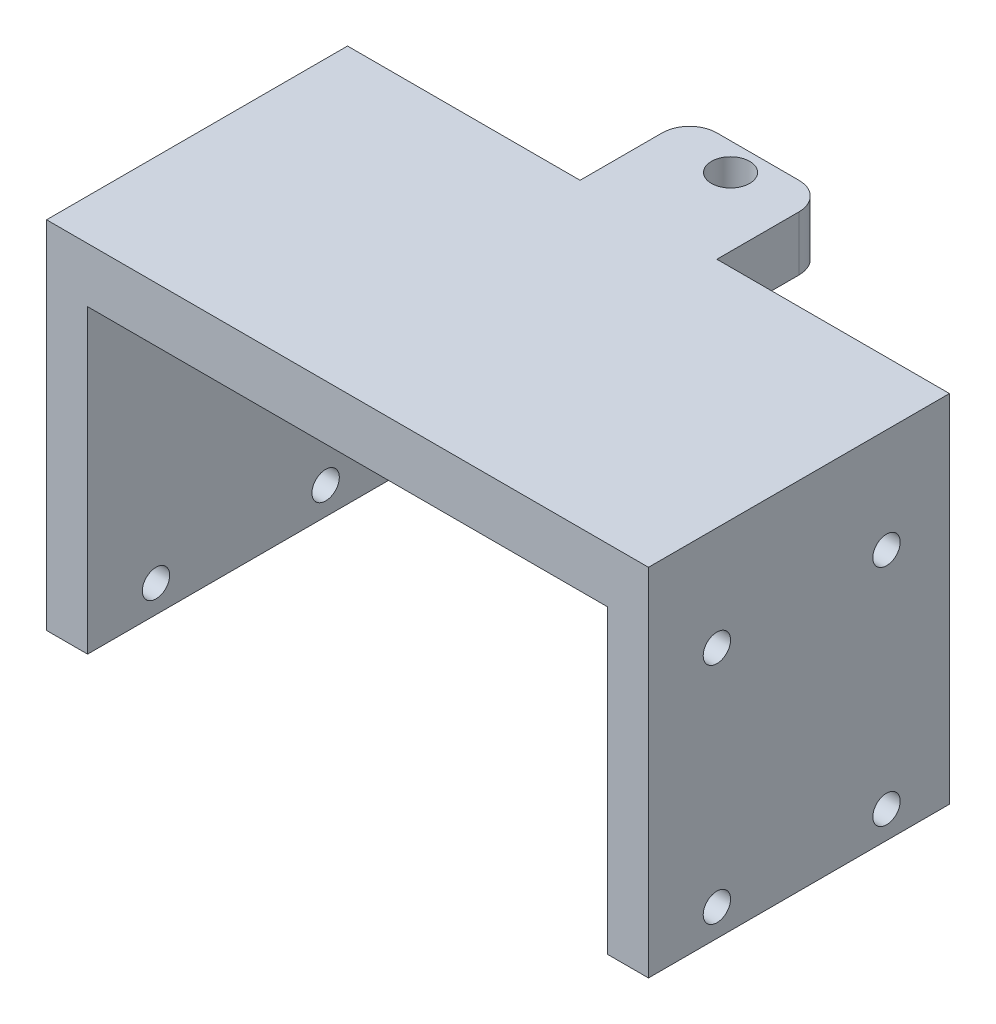
ISO-10303-21;
HEADER;
FILE_DESCRIPTION(('STEP AP214'),'2;1');
FILE_NAME('part.step','',(''),(''),'','','');
FILE_SCHEMA(('AUTOMOTIVE_DESIGN { 1 0 10303 214 1 1 1 1 }'));
ENDSEC;
DATA;
#1=APPLICATION_CONTEXT('core data for automotive mechanical design processes');
#2=APPLICATION_PROTOCOL_DEFINITION('international standard','automotive_design',2000,#1);
#3=PRODUCT_CONTEXT('',#1,'mechanical');
#4=PRODUCT('Part','Part','',(#3));
#5=PRODUCT_RELATED_PRODUCT_CATEGORY('part','',(#4));
#6=PRODUCT_DEFINITION_FORMATION('','',#4);
#7=PRODUCT_DEFINITION_CONTEXT('part definition',#1,'design');
#8=PRODUCT_DEFINITION('design','',#6,#7);
#9=PRODUCT_DEFINITION_SHAPE('','',#8);
#10=(LENGTH_UNIT() NAMED_UNIT(*) SI_UNIT(.MILLI.,.METRE.));
#11=(NAMED_UNIT(*) PLANE_ANGLE_UNIT() SI_UNIT($,.RADIAN.));
#12=(NAMED_UNIT(*) SI_UNIT($,.STERADIAN.) SOLID_ANGLE_UNIT());
#13=UNCERTAINTY_MEASURE_WITH_UNIT(LENGTH_MEASURE(1.E-05),#10,'distance_accuracy_value','');
#14=(GEOMETRIC_REPRESENTATION_CONTEXT(3) GLOBAL_UNCERTAINTY_ASSIGNED_CONTEXT((#13)) GLOBAL_UNIT_ASSIGNED_CONTEXT((#10,
#11,#12)) REPRESENTATION_CONTEXT('',''));
#15=CARTESIAN_POINT('',(0.,0.,0.));
#16=DIRECTION('',(0.,0.,1.));
#17=DIRECTION('',(1.,0.,0.));
#18=AXIS2_PLACEMENT_3D('',#15,#16,#17);
#19=CARTESIAN_POINT('',(0.,0.,0.));
#20=DIRECTION('',(0.,0.,1.));
#21=DIRECTION('',(1.,0.,0.));
#22=AXIS2_PLACEMENT_3D('',#19,#20,#21);
#23=PLANE('',#22);
#24=DIRECTION('',(0.,-1.,0.));
#25=VECTOR('',#24,1.);
#26=CARTESIAN_POINT('',(25.,65.,0.));
#27=LINE('',#26,#25);
#28=CARTESIAN_POINT('',(25.,65.,0.));
#29=VERTEX_POINT('',#28);
#30=CARTESIAN_POINT('',(25.,45.,0.));
#31=VERTEX_POINT('',#30);
#32=EDGE_CURVE('E161',#29,#31,#27,.T.);
#33=ORIENTED_EDGE('',*,*,#32,.F.);
#34=DIRECTION('',(-1.,0.,0.));
#35=VECTOR('',#34,1.);
#36=CARTESIAN_POINT('',(110.,65.,0.));
#37=LINE('',#36,#35);
#38=CARTESIAN_POINT('',(110.,65.,0.));
#39=VERTEX_POINT('',#38);
#40=EDGE_CURVE('E155',#39,#29,#37,.T.);
#41=ORIENTED_EDGE('',*,*,#40,.F.);
#42=DIRECTION('',(0.,1.,0.));
#43=VECTOR('',#42,1.);
#44=CARTESIAN_POINT('',(110.,-65.,0.));
#45=LINE('',#44,#43);
#46=CARTESIAN_POINT('',(110.,-65.,0.));
#47=VERTEX_POINT('',#46);
#48=EDGE_CURVE('E156',#47,#39,#45,.T.);
#49=ORIENTED_EDGE('',*,*,#48,.F.);
#50=DIRECTION('',(1.,0.,0.));
#51=VECTOR('',#50,1.);
#52=CARTESIAN_POINT('',(110.,-65.,0.));
#53=LINE('',#52,#51);
#54=CARTESIAN_POINT('',(95.,-65.,0.));
#55=VERTEX_POINT('',#54);
#56=EDGE_CURVE('E282',#55,#47,#53,.T.);
#57=ORIENTED_EDGE('',*,*,#56,.F.);
#58=DIRECTION('',(0.,1.,0.));
#59=VECTOR('',#58,1.);
#60=CARTESIAN_POINT('',(95.,-65.,0.));
#61=LINE('',#60,#59);
#62=CARTESIAN_POINT('',(95.,45.,0.));
#63=VERTEX_POINT('',#62);
#64=EDGE_CURVE('E225',#55,#63,#61,.T.);
#65=ORIENTED_EDGE('',*,*,#64,.T.);
#66=DIRECTION('',(-1.,0.,0.));
#67=VECTOR('',#66,1.);
#68=CARTESIAN_POINT('',(-95.,45.,0.));
#69=LINE('',#68,#67);
#70=EDGE_CURVE('E236',#63,#31,#69,.T.);
#71=ORIENTED_EDGE('',*,*,#70,.T.);
#72=EDGE_LOOP('',(#33,#41,#49,#57,#65,#71));
#73=FACE_BOUND('',#72,.T.);
#74=ADVANCED_FACE('F37',(#73),#23,.F.);
#75=DIRECTION('',(0.,1.,0.));
#76=VECTOR('',#75,1.);
#77=CARTESIAN_POINT('',(-25.,65.,0.));
#78=LINE('',#77,#76);
#79=CARTESIAN_POINT('',(-25.,45.,0.));
#80=VERTEX_POINT('',#79);
#81=CARTESIAN_POINT('',(-25.,65.,0.));
#82=VERTEX_POINT('',#81);
#83=EDGE_CURVE('E151',#80,#82,#78,.T.);
#84=ORIENTED_EDGE('',*,*,#83,.F.);
#85=CARTESIAN_POINT('',(-95.,45.,0.));
#86=VERTEX_POINT('',#85);
#87=EDGE_CURVE('E229',#80,#86,#69,.T.);
#88=ORIENTED_EDGE('',*,*,#87,.T.);
#89=DIRECTION('',(0.,-1.,0.));
#90=VECTOR('',#89,1.);
#91=CARTESIAN_POINT('',(-95.,-65.,0.));
#92=LINE('',#91,#90);
#93=CARTESIAN_POINT('',(-95.,-65.,0.));
#94=VERTEX_POINT('',#93);
#95=EDGE_CURVE('E222',#86,#94,#92,.T.);
#96=ORIENTED_EDGE('',*,*,#95,.T.);
#97=CARTESIAN_POINT('',(-110.,-65.,0.));
#98=VERTEX_POINT('',#97);
#99=EDGE_CURVE('E284',#98,#94,#53,.T.);
#100=ORIENTED_EDGE('',*,*,#99,.F.);
#101=DIRECTION('',(0.,-1.,0.));
#102=VECTOR('',#101,1.);
#103=CARTESIAN_POINT('',(-110.,-65.,0.));
#104=LINE('',#103,#102);
#105=CARTESIAN_POINT('',(-110.,65.,0.));
#106=VERTEX_POINT('',#105);
#107=EDGE_CURVE('E154',#106,#98,#104,.T.);
#108=ORIENTED_EDGE('',*,*,#107,.F.);
#109=EDGE_CURVE('E139',#82,#106,#37,.T.);
#110=ORIENTED_EDGE('',*,*,#109,.F.);
#111=EDGE_LOOP('',(#84,#88,#96,#100,#108,#110));
#112=FACE_BOUND('',#111,.T.);
#113=ADVANCED_FACE('F150',(#112),#23,.F.);
#114=CARTESIAN_POINT('',(110.,-65.,110.));
#115=DIRECTION('',(0.,1.,0.));
#116=DIRECTION('',(-1.,0.,0.));
#117=AXIS2_PLACEMENT_3D('',#114,#115,#116);
#118=PLANE('',#117);
#119=ORIENTED_EDGE('',*,*,#99,.T.);
#120=DIRECTION('',(0.,0.,1.));
#121=VECTOR('',#120,1.);
#122=CARTESIAN_POINT('',(-95.,-65.,0.));
#123=LINE('',#122,#121);
#124=CARTESIAN_POINT('',(-95.,-65.,110.));
#125=VERTEX_POINT('',#124);
#126=EDGE_CURVE('E239',#94,#125,#123,.T.);
#127=ORIENTED_EDGE('',*,*,#126,.T.);
#128=DIRECTION('',(1.,0.,0.));
#129=VECTOR('',#128,1.);
#130=CARTESIAN_POINT('',(110.,-65.,110.));
#131=LINE('',#130,#129);
#132=CARTESIAN_POINT('',(-110.,-65.,110.));
#133=VERTEX_POINT('',#132);
#134=EDGE_CURVE('E274',#133,#125,#131,.T.);
#135=ORIENTED_EDGE('',*,*,#134,.F.);
#136=DIRECTION('',(0.,0.,-1.));
#137=VECTOR('',#136,1.);
#138=CARTESIAN_POINT('',(-110.,-65.,110.));
#139=LINE('',#138,#137);
#140=EDGE_CURVE('E248',#133,#98,#139,.T.);
#141=ORIENTED_EDGE('',*,*,#140,.T.);
#142=EDGE_LOOP('',(#119,#127,#135,#141));
#143=FACE_BOUND('',#142,.T.);
#144=ADVANCED_FACE('F349',(#143),#118,.F.);
#145=CARTESIAN_POINT('',(-110.,-65.,110.));
#146=DIRECTION('',(1.,0.,0.));
#147=DIRECTION('',(0.,0.,-1.));
#148=AXIS2_PLACEMENT_3D('',#145,#146,#147);
#149=PLANE('',#148);
#150=CARTESIAN_POINT('',(-110.,27.,23.));
#151=DIRECTION('',(-1.,0.,0.));
#152=DIRECTION('',(0.,0.,1.));
#153=AXIS2_PLACEMENT_3D('',#150,#151,#152);
#154=CIRCLE('',#153,5.);
#155=CARTESIAN_POINT('',(-110.,27.,28.));
#156=VERTEX_POINT('',#155);
#157=EDGE_CURVE('E180',#156,#156,#154,.T.);
#158=ORIENTED_EDGE('',*,*,#157,.F.);
#159=EDGE_LOOP('',(#158));
#160=FACE_BOUND('',#159,.T.);
#161=CARTESIAN_POINT('',(-110.,27.,85.));
#162=DIRECTION('',(-1.,0.,0.));
#163=DIRECTION('',(0.,0.,1.));
#164=AXIS2_PLACEMENT_3D('',#161,#162,#163);
#165=CIRCLE('',#164,5.);
#166=CARTESIAN_POINT('',(-110.,27.,90.));
#167=VERTEX_POINT('',#166);
#168=EDGE_CURVE('E191',#167,#167,#165,.T.);
#169=ORIENTED_EDGE('',*,*,#168,.F.);
#170=EDGE_LOOP('',(#169));
#171=FACE_BOUND('',#170,.T.);
#172=CARTESIAN_POINT('',(-110.,-55.,85.));
#173=DIRECTION('',(-1.,0.,0.));
#174=DIRECTION('',(0.,0.,1.));
#175=AXIS2_PLACEMENT_3D('',#172,#173,#174);
#176=CIRCLE('',#175,5.);
#177=CARTESIAN_POINT('',(-110.,-55.,90.));
#178=VERTEX_POINT('',#177);
#179=EDGE_CURVE('E201',#178,#178,#176,.T.);
#180=ORIENTED_EDGE('',*,*,#179,.F.);
#181=EDGE_LOOP('',(#180));
#182=FACE_BOUND('',#181,.T.);
#183=CARTESIAN_POINT('',(-110.,-55.,23.));
#184=DIRECTION('',(-1.,0.,0.));
#185=DIRECTION('',(0.,0.,1.));
#186=AXIS2_PLACEMENT_3D('',#183,#184,#185);
#187=CIRCLE('',#186,5.);
#188=CARTESIAN_POINT('',(-110.,-55.,28.));
#189=VERTEX_POINT('',#188);
#190=EDGE_CURVE('E211',#189,#189,#187,.T.);
#191=ORIENTED_EDGE('',*,*,#190,.F.);
#192=EDGE_LOOP('',(#191));
#193=FACE_BOUND('',#192,.T.);
#194=ORIENTED_EDGE('',*,*,#107,.T.);
#195=ORIENTED_EDGE('',*,*,#140,.F.);
#196=DIRECTION('',(0.,-1.,0.));
#197=VECTOR('',#196,1.);
#198=CARTESIAN_POINT('',(-110.,-65.,110.));
#199=LINE('',#198,#197);
#200=CARTESIAN_POINT('',(-110.,65.,110.));
#201=VERTEX_POINT('',#200);
#202=EDGE_CURVE('E265',#201,#133,#199,.T.);
#203=ORIENTED_EDGE('',*,*,#202,.F.);
#204=DIRECTION('',(0.,0.,-1.));
#205=VECTOR('',#204,1.);
#206=CARTESIAN_POINT('',(-110.,65.,110.));
#207=LINE('',#206,#205);
#208=EDGE_CURVE('E258',#201,#106,#207,.T.);
#209=ORIENTED_EDGE('',*,*,#208,.T.);
#210=EDGE_LOOP('',(#194,#195,#203,#209));
#211=FACE_BOUND('',#210,.T.);
#212=ADVANCED_FACE('F361',(#160,#171,#182,#193,#211),#149,.F.);
#213=CARTESIAN_POINT('',(95.,-65.,110.));
#214=VERTEX_POINT('',#213);
#215=CARTESIAN_POINT('',(110.,-65.,110.));
#216=VERTEX_POINT('',#215);
#217=EDGE_CURVE('E268',#214,#216,#131,.T.);
#218=ORIENTED_EDGE('',*,*,#217,.F.);
#219=DIRECTION('',(0.,0.,1.));
#220=VECTOR('',#219,1.);
#221=CARTESIAN_POINT('',(95.,-65.,0.));
#222=LINE('',#221,#220);
#223=EDGE_CURVE('E295',#55,#214,#222,.T.);
#224=ORIENTED_EDGE('',*,*,#223,.F.);
#225=ORIENTED_EDGE('',*,*,#56,.T.);
#226=DIRECTION('',(0.,0.,-1.));
#227=VECTOR('',#226,1.);
#228=CARTESIAN_POINT('',(110.,-65.,110.));
#229=LINE('',#228,#227);
#230=EDGE_CURVE('E252',#216,#47,#229,.T.);
#231=ORIENTED_EDGE('',*,*,#230,.F.);
#232=EDGE_LOOP('',(#218,#224,#225,#231));
#233=FACE_BOUND('',#232,.T.);
#234=ADVANCED_FACE('F293',(#233),#118,.F.);
#235=CARTESIAN_POINT('',(110.,-65.,110.));
#236=DIRECTION('',(-1.,0.,0.));
#237=DIRECTION('',(0.,0.,1.));
#238=AXIS2_PLACEMENT_3D('',#235,#236,#237);
#239=PLANE('',#238);
#240=CARTESIAN_POINT('',(110.,27.,23.));
#241=DIRECTION('',(-1.,0.,0.));
#242=DIRECTION('',(0.,0.,1.));
#243=AXIS2_PLACEMENT_3D('',#240,#241,#242);
#244=CIRCLE('',#243,4.99999999999995);
#245=CARTESIAN_POINT('',(110.,27.,27.9999999999999));
#246=VERTEX_POINT('',#245);
#247=EDGE_CURVE('E183',#246,#246,#244,.T.);
#248=ORIENTED_EDGE('',*,*,#247,.T.);
#249=EDGE_LOOP('',(#248));
#250=FACE_BOUND('',#249,.T.);
#251=CARTESIAN_POINT('',(110.,27.,85.));
#252=DIRECTION('',(-1.,0.,0.));
#253=DIRECTION('',(0.,0.,1.));
#254=AXIS2_PLACEMENT_3D('',#251,#252,#253);
#255=CIRCLE('',#254,4.99999999999995);
#256=CARTESIAN_POINT('',(110.,27.,89.9999999999999));
#257=VERTEX_POINT('',#256);
#258=EDGE_CURVE('E194',#257,#257,#255,.T.);
#259=ORIENTED_EDGE('',*,*,#258,.T.);
#260=EDGE_LOOP('',(#259));
#261=FACE_BOUND('',#260,.T.);
#262=CARTESIAN_POINT('',(110.,-55.,85.));
#263=DIRECTION('',(-1.,0.,0.));
#264=DIRECTION('',(0.,0.,1.));
#265=AXIS2_PLACEMENT_3D('',#262,#263,#264);
#266=CIRCLE('',#265,4.99999999999995);
#267=CARTESIAN_POINT('',(110.,-55.,89.9999999999999));
#268=VERTEX_POINT('',#267);
#269=EDGE_CURVE('E204',#268,#268,#266,.T.);
#270=ORIENTED_EDGE('',*,*,#269,.T.);
#271=EDGE_LOOP('',(#270));
#272=FACE_BOUND('',#271,.T.);
#273=CARTESIAN_POINT('',(110.,-55.,23.));
#274=DIRECTION('',(-1.,0.,0.));
#275=DIRECTION('',(0.,0.,1.));
#276=AXIS2_PLACEMENT_3D('',#273,#274,#275);
#277=CIRCLE('',#276,4.99999999999995);
#278=CARTESIAN_POINT('',(110.,-55.,27.9999999999999));
#279=VERTEX_POINT('',#278);
#280=EDGE_CURVE('E214',#279,#279,#277,.T.);
#281=ORIENTED_EDGE('',*,*,#280,.T.);
#282=EDGE_LOOP('',(#281));
#283=FACE_BOUND('',#282,.T.);
#284=ORIENTED_EDGE('',*,*,#48,.T.);
#285=DIRECTION('',(0.,0.,-1.));
#286=VECTOR('',#285,1.);
#287=CARTESIAN_POINT('',(110.,65.,110.));
#288=LINE('',#287,#286);
#289=CARTESIAN_POINT('',(110.,65.,110.));
#290=VERTEX_POINT('',#289);
#291=EDGE_CURVE('E255',#290,#39,#288,.T.);
#292=ORIENTED_EDGE('',*,*,#291,.F.);
#293=DIRECTION('',(0.,1.,0.));
#294=VECTOR('',#293,1.);
#295=CARTESIAN_POINT('',(110.,-65.,110.));
#296=LINE('',#295,#294);
#297=EDGE_CURVE('E279',#216,#290,#296,.T.);
#298=ORIENTED_EDGE('',*,*,#297,.F.);
#299=ORIENTED_EDGE('',*,*,#230,.T.);
#300=EDGE_LOOP('',(#284,#292,#298,#299));
#301=FACE_BOUND('',#300,.T.);
#302=ADVANCED_FACE('F299',(#250,#261,#272,#283,#301),#239,.F.);
#303=CARTESIAN_POINT('',(110.,65.,110.));
#304=DIRECTION('',(0.,-1.,0.));
#305=DIRECTION('',(1.,0.,0.));
#306=AXIS2_PLACEMENT_3D('',#303,#304,#305);
#307=PLANE('',#306);
#308=CARTESIAN_POINT('',(0.,65.,-30.));
#309=DIRECTION('',(0.,1.,0.));
#310=DIRECTION('',(0.,0.,1.));
#311=AXIS2_PLACEMENT_3D('',#308,#309,#310);
#312=CIRCLE('',#311,7.);
#313=CARTESIAN_POINT('',(0.,65.,-23.));
#314=VERTEX_POINT('',#313);
#315=EDGE_CURVE('E620',#314,#314,#312,.T.);
#316=ORIENTED_EDGE('',*,*,#315,.F.);
#317=EDGE_LOOP('',(#316));
#318=FACE_BOUND('',#317,.T.);
#319=DIRECTION('',(0.,0.,1.));
#320=VECTOR('',#319,1.);
#321=CARTESIAN_POINT('',(25.,65.,-40.));
#322=LINE('',#321,#320);
#323=CARTESIAN_POINT('',(25.,65.,-30.));
#324=VERTEX_POINT('',#323);
#325=EDGE_CURVE('E145',#324,#29,#322,.T.);
#326=ORIENTED_EDGE('',*,*,#325,.F.);
#327=CARTESIAN_POINT('',(15.,65.,-30.));
#328=DIRECTION('',(0.,-1.,0.));
#329=DIRECTION('',(1.,0.,0.));
#330=AXIS2_PLACEMENT_3D('',#327,#328,#329);
#331=CIRCLE('',#330,10.);
#332=CARTESIAN_POINT('',(15.,65.,-40.));
#333=VERTEX_POINT('',#332);
#334=EDGE_CURVE('E45',#324,#333,#331,.F.);
#335=ORIENTED_EDGE('',*,*,#334,.T.);
#336=DIRECTION('',(1.,0.,0.));
#337=VECTOR('',#336,1.);
#338=CARTESIAN_POINT('',(25.,65.,-40.));
#339=LINE('',#338,#337);
#340=CARTESIAN_POINT('',(-15.,65.,-40.));
#341=VERTEX_POINT('',#340);
#342=EDGE_CURVE('E164',#341,#333,#339,.T.);
#343=ORIENTED_EDGE('',*,*,#342,.F.);
#344=CARTESIAN_POINT('',(-15.,65.,-30.));
#345=DIRECTION('',(0.,-1.,0.));
#346=DIRECTION('',(1.,0.,0.));
#347=AXIS2_PLACEMENT_3D('',#344,#345,#346);
#348=CIRCLE('',#347,10.);
#349=CARTESIAN_POINT('',(-25.,65.,-30.));
#350=VERTEX_POINT('',#349);
#351=EDGE_CURVE('E52',#341,#350,#348,.F.);
#352=ORIENTED_EDGE('',*,*,#351,.T.);
#353=DIRECTION('',(0.,0.,1.));
#354=VECTOR('',#353,1.);
#355=CARTESIAN_POINT('',(-25.,65.,-40.));
#356=LINE('',#355,#354);
#357=EDGE_CURVE('E135',#350,#82,#356,.T.);
#358=ORIENTED_EDGE('',*,*,#357,.T.);
#359=ORIENTED_EDGE('',*,*,#109,.T.);
#360=ORIENTED_EDGE('',*,*,#208,.F.);
#361=DIRECTION('',(-1.,0.,0.));
#362=VECTOR('',#361,1.);
#363=CARTESIAN_POINT('',(110.,65.,110.));
#364=LINE('',#363,#362);
#365=EDGE_CURVE('E259',#290,#201,#364,.T.);
#366=ORIENTED_EDGE('',*,*,#365,.F.);
#367=ORIENTED_EDGE('',*,*,#291,.T.);
#368=ORIENTED_EDGE('',*,*,#40,.T.);
#369=EDGE_LOOP('',(#326,#335,#343,#352,#358,#359,#360,#366,#367,#368));
#370=FACE_BOUND('',#369,.T.);
#371=ADVANCED_FACE('F137',(#318,#370),#307,.F.);
#372=CARTESIAN_POINT('',(0.,0.,110.));
#373=DIRECTION('',(0.,0.,1.));
#374=DIRECTION('',(1.,0.,0.));
#375=AXIS2_PLACEMENT_3D('',#372,#373,#374);
#376=PLANE('',#375);
#377=DIRECTION('',(0.,-1.,0.));
#378=VECTOR('',#377,1.);
#379=CARTESIAN_POINT('',(-95.,-65.,110.));
#380=LINE('',#379,#378);
#381=CARTESIAN_POINT('',(-95.,45.,110.));
#382=VERTEX_POINT('',#381);
#383=EDGE_CURVE('E221',#382,#125,#380,.T.);
#384=ORIENTED_EDGE('',*,*,#383,.F.);
#385=DIRECTION('',(-1.,0.,0.));
#386=VECTOR('',#385,1.);
#387=CARTESIAN_POINT('',(-95.,45.,110.));
#388=LINE('',#387,#386);
#389=CARTESIAN_POINT('',(95.,45.,110.));
#390=VERTEX_POINT('',#389);
#391=EDGE_CURVE('E226',#390,#382,#388,.T.);
#392=ORIENTED_EDGE('',*,*,#391,.F.);
#393=DIRECTION('',(0.,1.,0.));
#394=VECTOR('',#393,1.);
#395=CARTESIAN_POINT('',(95.,-65.,110.));
#396=LINE('',#395,#394);
#397=EDGE_CURVE('E380',#214,#390,#396,.T.);
#398=ORIENTED_EDGE('',*,*,#397,.F.);
#399=ORIENTED_EDGE('',*,*,#217,.T.);
#400=ORIENTED_EDGE('',*,*,#297,.T.);
#401=ORIENTED_EDGE('',*,*,#365,.T.);
#402=ORIENTED_EDGE('',*,*,#202,.T.);
#403=ORIENTED_EDGE('',*,*,#134,.T.);
#404=EDGE_LOOP('',(#384,#392,#398,#399,#400,#401,#402,#403));
#405=FACE_BOUND('',#404,.T.);
#406=ADVANCED_FACE('F352',(#405),#376,.T.);
#407=CARTESIAN_POINT('',(-95.,-65.,0.));
#408=DIRECTION('',(-1.,0.,0.));
#409=DIRECTION('',(0.,0.,1.));
#410=AXIS2_PLACEMENT_3D('',#407,#408,#409);
#411=PLANE('',#410);
#412=CARTESIAN_POINT('',(-95.,27.,23.));
#413=DIRECTION('',(-1.,0.,0.));
#414=DIRECTION('',(0.,0.,1.));
#415=AXIS2_PLACEMENT_3D('',#412,#413,#414);
#416=CIRCLE('',#415,4.99999999999997);
#417=CARTESIAN_POINT('',(-95.,27.,28.));
#418=VERTEX_POINT('',#417);
#419=EDGE_CURVE('E187',#418,#418,#416,.T.);
#420=ORIENTED_EDGE('',*,*,#419,.T.);
#421=EDGE_LOOP('',(#420));
#422=FACE_BOUND('',#421,.T.);
#423=CARTESIAN_POINT('',(-95.,27.,85.));
#424=DIRECTION('',(-1.,0.,0.));
#425=DIRECTION('',(0.,0.,1.));
#426=AXIS2_PLACEMENT_3D('',#423,#424,#425);
#427=CIRCLE('',#426,4.99999999999997);
#428=CARTESIAN_POINT('',(-95.,27.,90.));
#429=VERTEX_POINT('',#428);
#430=EDGE_CURVE('E198',#429,#429,#427,.T.);
#431=ORIENTED_EDGE('',*,*,#430,.T.);
#432=EDGE_LOOP('',(#431));
#433=FACE_BOUND('',#432,.T.);
#434=CARTESIAN_POINT('',(-95.,-55.,85.));
#435=DIRECTION('',(-1.,0.,0.));
#436=DIRECTION('',(0.,0.,1.));
#437=AXIS2_PLACEMENT_3D('',#434,#435,#436);
#438=CIRCLE('',#437,4.99999999999997);
#439=CARTESIAN_POINT('',(-95.,-55.,90.));
#440=VERTEX_POINT('',#439);
#441=EDGE_CURVE('E208',#440,#440,#438,.T.);
#442=ORIENTED_EDGE('',*,*,#441,.T.);
#443=EDGE_LOOP('',(#442));
#444=FACE_BOUND('',#443,.T.);
#445=CARTESIAN_POINT('',(-95.,-55.,23.));
#446=DIRECTION('',(-1.,0.,0.));
#447=DIRECTION('',(0.,0.,1.));
#448=AXIS2_PLACEMENT_3D('',#445,#446,#447);
#449=CIRCLE('',#448,4.99999999999997);
#450=CARTESIAN_POINT('',(-95.,-55.,28.));
#451=VERTEX_POINT('',#450);
#452=EDGE_CURVE('E218',#451,#451,#449,.T.);
#453=ORIENTED_EDGE('',*,*,#452,.T.);
#454=EDGE_LOOP('',(#453));
#455=FACE_BOUND('',#454,.T.);
#456=ORIENTED_EDGE('',*,*,#383,.T.);
#457=ORIENTED_EDGE('',*,*,#126,.F.);
#458=ORIENTED_EDGE('',*,*,#95,.F.);
#459=DIRECTION('',(0.,0.,1.));
#460=VECTOR('',#459,1.);
#461=CARTESIAN_POINT('',(-95.,45.,0.));
#462=LINE('',#461,#460);
#463=EDGE_CURVE('E283',#86,#382,#462,.T.);
#464=ORIENTED_EDGE('',*,*,#463,.T.);
#465=EDGE_LOOP('',(#456,#457,#458,#464));
#466=FACE_BOUND('',#465,.T.);
#467=ADVANCED_FACE('F390',(#422,#433,#444,#455,#466),#411,.F.);
#468=CARTESIAN_POINT('',(-95.,45.,0.));
#469=DIRECTION('',(0.,1.,0.));
#470=DIRECTION('',(0.,0.,1.));
#471=AXIS2_PLACEMENT_3D('',#468,#469,#470);
#472=PLANE('',#471);
#473=CARTESIAN_POINT('',(0.,45.,-30.));
#474=DIRECTION('',(0.,1.,0.));
#475=DIRECTION('',(0.,0.,1.));
#476=AXIS2_PLACEMENT_3D('',#473,#474,#475);
#477=CIRCLE('',#476,6.99999999999999);
#478=CARTESIAN_POINT('',(0.,45.,-23.));
#479=VERTEX_POINT('',#478);
#480=EDGE_CURVE('E167',#479,#479,#477,.T.);
#481=ORIENTED_EDGE('',*,*,#480,.T.);
#482=EDGE_LOOP('',(#481));
#483=FACE_BOUND('',#482,.T.);
#484=DIRECTION('',(-1.,0.,0.));
#485=VECTOR('',#484,1.);
#486=CARTESIAN_POINT('',(25.,45.,-40.));
#487=LINE('',#486,#485);
#488=CARTESIAN_POINT('',(15.,45.,-40.));
#489=VERTEX_POINT('',#488);
#490=CARTESIAN_POINT('',(-15.,45.,-40.));
#491=VERTEX_POINT('',#490);
#492=EDGE_CURVE('E160',#489,#491,#487,.T.);
#493=ORIENTED_EDGE('',*,*,#492,.F.);
#494=CARTESIAN_POINT('',(15.,45.,-30.));
#495=DIRECTION('',(0.,1.,0.));
#496=DIRECTION('',(0.,0.,1.));
#497=AXIS2_PLACEMENT_3D('',#494,#495,#496);
#498=CIRCLE('',#497,10.);
#499=CARTESIAN_POINT('',(25.,45.,-30.));
#500=VERTEX_POINT('',#499);
#501=EDGE_CURVE('E309',#489,#500,#498,.F.);
#502=ORIENTED_EDGE('',*,*,#501,.T.);
#503=DIRECTION('',(0.,0.,1.));
#504=VECTOR('',#503,1.);
#505=CARTESIAN_POINT('',(25.,45.,-40.));
#506=LINE('',#505,#504);
#507=EDGE_CURVE('E184',#500,#31,#506,.T.);
#508=ORIENTED_EDGE('',*,*,#507,.T.);
#509=ORIENTED_EDGE('',*,*,#70,.F.);
#510=DIRECTION('',(0.,0.,1.));
#511=VECTOR('',#510,1.);
#512=CARTESIAN_POINT('',(95.,45.,0.));
#513=LINE('',#512,#511);
#514=EDGE_CURVE('E387',#63,#390,#513,.T.);
#515=ORIENTED_EDGE('',*,*,#514,.T.);
#516=ORIENTED_EDGE('',*,*,#391,.T.);
#517=ORIENTED_EDGE('',*,*,#463,.F.);
#518=ORIENTED_EDGE('',*,*,#87,.F.);
#519=DIRECTION('',(0.,0.,1.));
#520=VECTOR('',#519,1.);
#521=CARTESIAN_POINT('',(-25.,45.,-40.));
#522=LINE('',#521,#520);
#523=CARTESIAN_POINT('',(-25.,45.,-30.));
#524=VERTEX_POINT('',#523);
#525=EDGE_CURVE('E144',#524,#80,#522,.T.);
#526=ORIENTED_EDGE('',*,*,#525,.F.);
#527=CARTESIAN_POINT('',(-15.,45.,-30.));
#528=DIRECTION('',(0.,1.,0.));
#529=DIRECTION('',(0.,0.,1.));
#530=AXIS2_PLACEMENT_3D('',#527,#528,#529);
#531=CIRCLE('',#530,10.);
#532=EDGE_CURVE('E319',#524,#491,#531,.F.);
#533=ORIENTED_EDGE('',*,*,#532,.T.);
#534=EDGE_LOOP('',(#493,#502,#508,#509,#515,#516,#517,#518,#526,#533));
#535=FACE_BOUND('',#534,.T.);
#536=ADVANCED_FACE('F392',(#483,#535),#472,.F.);
#537=CARTESIAN_POINT('',(95.,-65.,0.));
#538=DIRECTION('',(1.,0.,0.));
#539=DIRECTION('',(0.,0.,-1.));
#540=AXIS2_PLACEMENT_3D('',#537,#538,#539);
#541=PLANE('',#540);
#542=CARTESIAN_POINT('',(95.,27.,23.));
#543=DIRECTION('',(1.,0.,0.));
#544=DIRECTION('',(0.,0.,-1.));
#545=AXIS2_PLACEMENT_3D('',#542,#543,#544);
#546=CIRCLE('',#545,4.99999999999997);
#547=CARTESIAN_POINT('',(95.,27.,18.));
#548=VERTEX_POINT('',#547);
#549=EDGE_CURVE('E188',#548,#548,#546,.T.);
#550=ORIENTED_EDGE('',*,*,#549,.T.);
#551=EDGE_LOOP('',(#550));
#552=FACE_BOUND('',#551,.T.);
#553=CARTESIAN_POINT('',(95.,27.,85.));
#554=DIRECTION('',(1.,0.,0.));
#555=DIRECTION('',(0.,0.,-1.));
#556=AXIS2_PLACEMENT_3D('',#553,#554,#555);
#557=CIRCLE('',#556,4.99999999999997);
#558=CARTESIAN_POINT('',(95.,27.,80.));
#559=VERTEX_POINT('',#558);
#560=EDGE_CURVE('E197',#559,#559,#557,.T.);
#561=ORIENTED_EDGE('',*,*,#560,.T.);
#562=EDGE_LOOP('',(#561));
#563=FACE_BOUND('',#562,.T.);
#564=CARTESIAN_POINT('',(95.,-55.,85.));
#565=DIRECTION('',(1.,0.,0.));
#566=DIRECTION('',(0.,0.,-1.));
#567=AXIS2_PLACEMENT_3D('',#564,#565,#566);
#568=CIRCLE('',#567,4.99999999999997);
#569=CARTESIAN_POINT('',(95.,-55.,80.));
#570=VERTEX_POINT('',#569);
#571=EDGE_CURVE('E207',#570,#570,#568,.T.);
#572=ORIENTED_EDGE('',*,*,#571,.T.);
#573=EDGE_LOOP('',(#572));
#574=FACE_BOUND('',#573,.T.);
#575=CARTESIAN_POINT('',(95.,-55.,23.));
#576=DIRECTION('',(1.,0.,0.));
#577=DIRECTION('',(0.,0.,-1.));
#578=AXIS2_PLACEMENT_3D('',#575,#576,#577);
#579=CIRCLE('',#578,4.99999999999997);
#580=CARTESIAN_POINT('',(95.,-55.,18.));
#581=VERTEX_POINT('',#580);
#582=EDGE_CURVE('E217',#581,#581,#579,.T.);
#583=ORIENTED_EDGE('',*,*,#582,.T.);
#584=EDGE_LOOP('',(#583));
#585=FACE_BOUND('',#584,.T.);
#586=ORIENTED_EDGE('',*,*,#397,.T.);
#587=ORIENTED_EDGE('',*,*,#514,.F.);
#588=ORIENTED_EDGE('',*,*,#64,.F.);
#589=ORIENTED_EDGE('',*,*,#223,.T.);
#590=EDGE_LOOP('',(#586,#587,#588,#589));
#591=FACE_BOUND('',#590,.T.);
#592=ADVANCED_FACE('F393',(#552,#563,#574,#585,#591),#541,.F.);
#593=CARTESIAN_POINT('',(-110.,-55.,23.));
#594=DIRECTION('',(-1.,0.,0.));
#595=DIRECTION('',(0.,0.,1.));
#596=AXIS2_PLACEMENT_3D('',#593,#594,#595);
#597=CYLINDRICAL_SURFACE('',#596,4.99999999999997);
#598=ORIENTED_EDGE('',*,*,#280,.F.);
#599=EDGE_LOOP('',(#598));
#600=FACE_BOUND('',#599,.T.);
#601=ORIENTED_EDGE('',*,*,#582,.F.);
#602=EDGE_LOOP('',(#601));
#603=FACE_BOUND('',#602,.T.);
#604=ADVANCED_FACE('F395',(#600,#603),#597,.F.);
#605=ORIENTED_EDGE('',*,*,#190,.T.);
#606=EDGE_LOOP('',(#605));
#607=FACE_BOUND('',#606,.T.);
#608=ORIENTED_EDGE('',*,*,#452,.F.);
#609=EDGE_LOOP('',(#608));
#610=FACE_BOUND('',#609,.T.);
#611=ADVANCED_FACE('F402',(#607,#610),#597,.F.);
#612=CARTESIAN_POINT('',(-110.,-55.,85.));
#613=DIRECTION('',(-1.,0.,0.));
#614=DIRECTION('',(0.,0.,1.));
#615=AXIS2_PLACEMENT_3D('',#612,#613,#614);
#616=CYLINDRICAL_SURFACE('',#615,4.99999999999997);
#617=ORIENTED_EDGE('',*,*,#269,.F.);
#618=EDGE_LOOP('',(#617));
#619=FACE_BOUND('',#618,.T.);
#620=ORIENTED_EDGE('',*,*,#571,.F.);
#621=EDGE_LOOP('',(#620));
#622=FACE_BOUND('',#621,.T.);
#623=ADVANCED_FACE('F422',(#619,#622),#616,.F.);
#624=ORIENTED_EDGE('',*,*,#179,.T.);
#625=EDGE_LOOP('',(#624));
#626=FACE_BOUND('',#625,.T.);
#627=ORIENTED_EDGE('',*,*,#441,.F.);
#628=EDGE_LOOP('',(#627));
#629=FACE_BOUND('',#628,.T.);
#630=ADVANCED_FACE('F427',(#626,#629),#616,.F.);
#631=CARTESIAN_POINT('',(-110.,27.,85.));
#632=DIRECTION('',(-1.,0.,0.));
#633=DIRECTION('',(0.,0.,1.));
#634=AXIS2_PLACEMENT_3D('',#631,#632,#633);
#635=CYLINDRICAL_SURFACE('',#634,4.99999999999997);
#636=ORIENTED_EDGE('',*,*,#258,.F.);
#637=EDGE_LOOP('',(#636));
#638=FACE_BOUND('',#637,.T.);
#639=ORIENTED_EDGE('',*,*,#560,.F.);
#640=EDGE_LOOP('',(#639));
#641=FACE_BOUND('',#640,.T.);
#642=ADVANCED_FACE('F432',(#638,#641),#635,.F.);
#643=ORIENTED_EDGE('',*,*,#168,.T.);
#644=EDGE_LOOP('',(#643));
#645=FACE_BOUND('',#644,.T.);
#646=ORIENTED_EDGE('',*,*,#430,.F.);
#647=EDGE_LOOP('',(#646));
#648=FACE_BOUND('',#647,.T.);
#649=ADVANCED_FACE('F434',(#645,#648),#635,.F.);
#650=CARTESIAN_POINT('',(-110.,27.,23.));
#651=DIRECTION('',(-1.,0.,0.));
#652=DIRECTION('',(0.,0.,1.));
#653=AXIS2_PLACEMENT_3D('',#650,#651,#652);
#654=CYLINDRICAL_SURFACE('',#653,4.99999999999997);
#655=ORIENTED_EDGE('',*,*,#157,.T.);
#656=EDGE_LOOP('',(#655));
#657=FACE_BOUND('',#656,.T.);
#658=ORIENTED_EDGE('',*,*,#419,.F.);
#659=EDGE_LOOP('',(#658));
#660=FACE_BOUND('',#659,.T.);
#661=ADVANCED_FACE('F437',(#657,#660),#654,.F.);
#662=ORIENTED_EDGE('',*,*,#247,.F.);
#663=EDGE_LOOP('',(#662));
#664=FACE_BOUND('',#663,.T.);
#665=ORIENTED_EDGE('',*,*,#549,.F.);
#666=EDGE_LOOP('',(#665));
#667=FACE_BOUND('',#666,.T.);
#668=ADVANCED_FACE('F439',(#664,#667),#654,.F.);
#669=CARTESIAN_POINT('',(25.,65.,-40.));
#670=DIRECTION('',(-1.,0.,0.));
#671=DIRECTION('',(0.,-1.,0.));
#672=AXIS2_PLACEMENT_3D('',#669,#670,#671);
#673=PLANE('',#672);
#674=ORIENTED_EDGE('',*,*,#507,.F.);
#675=DIRECTION('',(0.,-1.,0.));
#676=VECTOR('',#675,1.);
#677=CARTESIAN_POINT('',(25.,65.,-30.));
#678=LINE('',#677,#676);
#679=EDGE_CURVE('E60',#500,#324,#678,.F.);
#680=ORIENTED_EDGE('',*,*,#679,.T.);
#681=ORIENTED_EDGE('',*,*,#325,.T.);
#682=ORIENTED_EDGE('',*,*,#32,.T.);
#683=EDGE_LOOP('',(#674,#680,#681,#682));
#684=FACE_BOUND('',#683,.T.);
#685=ADVANCED_FACE('F302',(#684),#673,.F.);
#686=CARTESIAN_POINT('',(-25.,65.,-40.));
#687=DIRECTION('',(1.,0.,0.));
#688=DIRECTION('',(0.,1.,0.));
#689=AXIS2_PLACEMENT_3D('',#686,#687,#688);
#690=PLANE('',#689);
#691=ORIENTED_EDGE('',*,*,#357,.F.);
#692=DIRECTION('',(0.,1.,0.));
#693=VECTOR('',#692,1.);
#694=CARTESIAN_POINT('',(-25.,45.,-30.));
#695=LINE('',#694,#693);
#696=EDGE_CURVE('E11',#350,#524,#695,.F.);
#697=ORIENTED_EDGE('',*,*,#696,.T.);
#698=ORIENTED_EDGE('',*,*,#525,.T.);
#699=ORIENTED_EDGE('',*,*,#83,.T.);
#700=EDGE_LOOP('',(#691,#697,#698,#699));
#701=FACE_BOUND('',#700,.T.);
#702=ADVANCED_FACE('F158',(#701),#690,.F.);
#703=CARTESIAN_POINT('',(0.,0.,-40.));
#704=DIRECTION('',(0.,0.,-1.));
#705=DIRECTION('',(-1.,0.,0.));
#706=AXIS2_PLACEMENT_3D('',#703,#704,#705);
#707=PLANE('',#706);
#708=ORIENTED_EDGE('',*,*,#342,.T.);
#709=DIRECTION('',(0.,-1.,0.));
#710=VECTOR('',#709,1.);
#711=CARTESIAN_POINT('',(15.,45.,-40.));
#712=LINE('',#711,#710);
#713=EDGE_CURVE('E316',#333,#489,#712,.T.);
#714=ORIENTED_EDGE('',*,*,#713,.T.);
#715=ORIENTED_EDGE('',*,*,#492,.T.);
#716=DIRECTION('',(0.,1.,0.));
#717=VECTOR('',#716,1.);
#718=CARTESIAN_POINT('',(-15.,65.,-40.));
#719=LINE('',#718,#717);
#720=EDGE_CURVE('E251',#491,#341,#719,.T.);
#721=ORIENTED_EDGE('',*,*,#720,.T.);
#722=EDGE_LOOP('',(#708,#714,#715,#721));
#723=FACE_BOUND('',#722,.T.);
#724=ADVANCED_FACE('F330',(#723),#707,.T.);
#725=CARTESIAN_POINT('',(0.,65.,-30.));
#726=DIRECTION('',(0.,1.,0.));
#727=DIRECTION('',(0.,0.,1.));
#728=AXIS2_PLACEMENT_3D('',#725,#726,#727);
#729=CYLINDRICAL_SURFACE('',#728,6.99999999999999);
#730=ORIENTED_EDGE('',*,*,#315,.T.);
#731=EDGE_LOOP('',(#730));
#732=FACE_BOUND('',#731,.T.);
#733=ORIENTED_EDGE('',*,*,#480,.F.);
#734=EDGE_LOOP('',(#733));
#735=FACE_BOUND('',#734,.T.);
#736=ADVANCED_FACE('F334',(#732,#735),#729,.F.);
#737=CARTESIAN_POINT('',(15.,0.,-30.));
#738=DIRECTION('',(0.,1.,0.));
#739=DIRECTION('',(-1.,0.,0.));
#740=AXIS2_PLACEMENT_3D('',#737,#738,#739);
#741=CYLINDRICAL_SURFACE('',#740,10.);
#742=ORIENTED_EDGE('',*,*,#334,.F.);
#743=ORIENTED_EDGE('',*,*,#679,.F.);
#744=ORIENTED_EDGE('',*,*,#501,.F.);
#745=ORIENTED_EDGE('',*,*,#713,.F.);
#746=EDGE_LOOP('',(#742,#743,#744,#745));
#747=FACE_BOUND('',#746,.T.);
#748=ADVANCED_FACE('F332',(#747),#741,.T.);
#749=CARTESIAN_POINT('',(-15.,0.,-30.));
#750=DIRECTION('',(0.,-1.,0.));
#751=DIRECTION('',(1.,0.,0.));
#752=AXIS2_PLACEMENT_3D('',#749,#750,#751);
#753=CYLINDRICAL_SURFACE('',#752,10.);
#754=ORIENTED_EDGE('',*,*,#532,.F.);
#755=ORIENTED_EDGE('',*,*,#696,.F.);
#756=ORIENTED_EDGE('',*,*,#351,.F.);
#757=ORIENTED_EDGE('',*,*,#720,.F.);
#758=EDGE_LOOP('',(#754,#755,#756,#757));
#759=FACE_BOUND('',#758,.T.);
#760=ADVANCED_FACE('F39',(#759),#753,.T.);
#761=CLOSED_SHELL('',(#74,#113,#144,#212,#234,#302,#371,#406,#467,#536,#592,#604,#611,#623,#630,
#642,#649,#661,#668,#685,#702,#724,#736,#748,#760));
#762=MANIFOLD_SOLID_BREP('B2',#761);
#763=ADVANCED_BREP_SHAPE_REPRESENTATION('',(#18,#762),#14);
#764=SHAPE_DEFINITION_REPRESENTATION(#9,#763);
ENDSEC;
END-ISO-10303-21;
